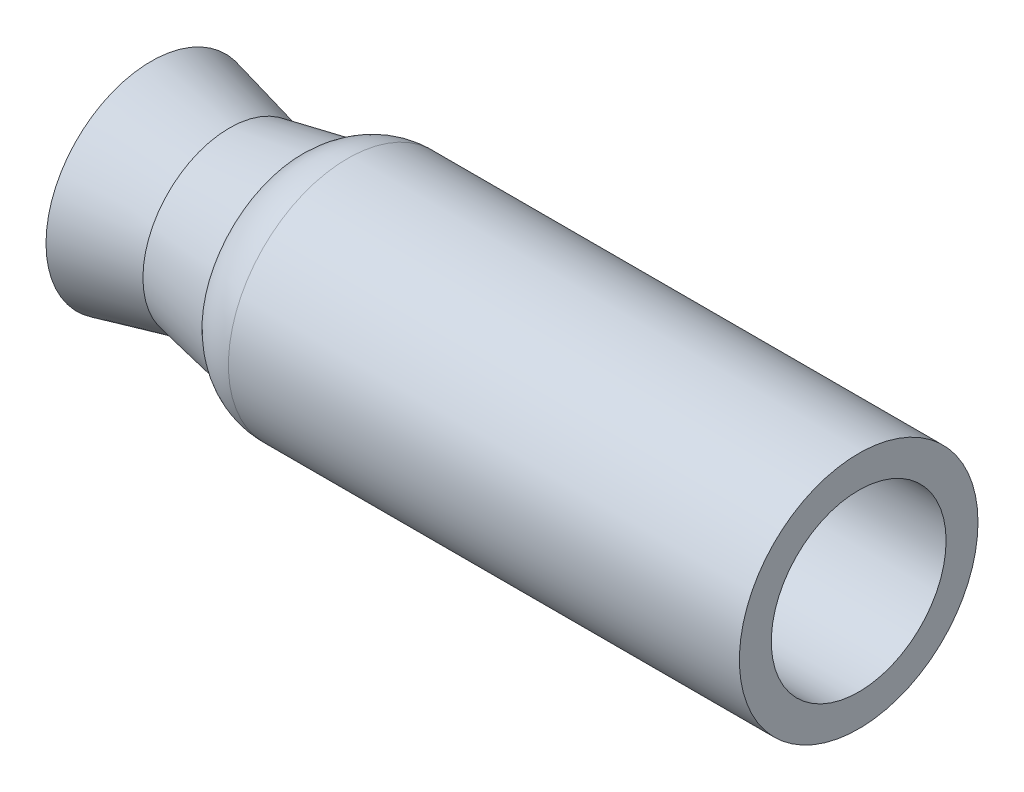
ISO-10303-21;
HEADER;
FILE_DESCRIPTION(('STEP AP214'),'2;1');
FILE_NAME('part.step','',(''),(''),'','','');
FILE_SCHEMA(('AUTOMOTIVE_DESIGN { 1 0 10303 214 1 1 1 1 }'));
ENDSEC;
DATA;
#1=APPLICATION_CONTEXT('core data for automotive mechanical design processes');
#2=APPLICATION_PROTOCOL_DEFINITION('international standard','automotive_design',2000,#1);
#3=PRODUCT_CONTEXT('',#1,'mechanical');
#4=PRODUCT('Part','Part','',(#3));
#5=PRODUCT_RELATED_PRODUCT_CATEGORY('part','',(#4));
#6=PRODUCT_DEFINITION_FORMATION('','',#4);
#7=PRODUCT_DEFINITION_CONTEXT('part definition',#1,'design');
#8=PRODUCT_DEFINITION('design','',#6,#7);
#9=PRODUCT_DEFINITION_SHAPE('','',#8);
#10=(LENGTH_UNIT() NAMED_UNIT(*) SI_UNIT(.MILLI.,.METRE.));
#11=(NAMED_UNIT(*) PLANE_ANGLE_UNIT() SI_UNIT($,.RADIAN.));
#12=(NAMED_UNIT(*) SI_UNIT($,.STERADIAN.) SOLID_ANGLE_UNIT());
#13=UNCERTAINTY_MEASURE_WITH_UNIT(LENGTH_MEASURE(1.E-05),#10,'distance_accuracy_value','');
#14=(GEOMETRIC_REPRESENTATION_CONTEXT(3) GLOBAL_UNCERTAINTY_ASSIGNED_CONTEXT((#13)) GLOBAL_UNIT_ASSIGNED_CONTEXT((#10,
#11,#12)) REPRESENTATION_CONTEXT('',''));
#15=CARTESIAN_POINT('',(0.,0.,0.));
#16=DIRECTION('',(0.,0.,1.));
#17=DIRECTION('',(1.,0.,0.));
#18=AXIS2_PLACEMENT_3D('',#15,#16,#17);
#19=CARTESIAN_POINT('',(-169.474152094102,0.,0.));
#20=DIRECTION('',(1.,0.,0.));
#21=DIRECTION('',(0.,0.,-1.));
#22=AXIS2_PLACEMENT_3D('',#19,#20,#21);
#23=CONICAL_SURFACE('',#22,32.9763480993508,1.32232360308428);
#24=CARTESIAN_POINT('',(-171.93339083728,0.,0.));
#25=DIRECTION('',(1.,0.,0.));
#26=DIRECTION('',(0.,0.,-1.));
#27=AXIS2_PLACEMENT_3D('',#24,#25,#26);
#28=CIRCLE('',#27,23.2834566419965);
#29=CARTESIAN_POINT('',(-171.93339083728,0.,-23.2834566419965));
#30=VERTEX_POINT('',#29);
#31=EDGE_CURVE('E10',#30,#30,#28,.T.);
#32=ORIENTED_EDGE('',*,*,#31,.T.);
#33=EDGE_LOOP('',(#32));
#34=FACE_BOUND('',#33,.T.);
#35=CARTESIAN_POINT('',(-169.474152094102,0.,0.));
#36=DIRECTION('',(1.,0.,0.));
#37=DIRECTION('',(0.,0.,-1.));
#38=AXIS2_PLACEMENT_3D('',#35,#36,#37);
#39=CIRCLE('',#38,32.9763480993508);
#40=CARTESIAN_POINT('',(-169.474152094102,0.,-32.9763480993508));
#41=VERTEX_POINT('',#40);
#42=EDGE_CURVE('E76',#41,#41,#39,.T.);
#43=ORIENTED_EDGE('',*,*,#42,.F.);
#44=EDGE_LOOP('',(#43));
#45=FACE_BOUND('',#44,.T.);
#46=ADVANCED_FACE('F36',(#34,#45),#23,.T.);
#47=CARTESIAN_POINT('',(-18311.1736527159,-1000016.27359422,0.));
#48=CARTESIAN_POINT('',(-2627.39774129121,1000027.16172781,0.));
#49=CARTESIAN_POINT('',(22663.0416842668,-999917.866935543,0.));
#50=B_SPLINE_CURVE_WITH_KNOTS('',2,(#47,#48,#49),.UNSPECIFIED.,.F.,.F.,(3,3),(0.,1.),.UNSPECIFIED.);
#51=CARTESIAN_POINT('',(0.,0.,0.));
#52=DIRECTION('',(1.,0.,0.));
#53=AXIS1_PLACEMENT('',#51,#52);
#54=SURFACE_OF_REVOLUTION('',#50,#53);
#55=CARTESIAN_POINT('',(-144.93339083728,0.,0.));
#56=DIRECTION('',(1.,0.,0.));
#57=DIRECTION('',(0.,0.,-1.));
#58=AXIS2_PLACEMENT_3D('',#55,#56,#57);
#59=CIRCLE('',#58,14.6999999999993);
#60=CARTESIAN_POINT('',(-144.93339083728,0.,-14.6999999999993));
#61=VERTEX_POINT('',#60);
#62=EDGE_CURVE('E42',#61,#61,#59,.T.);
#63=ORIENTED_EDGE('',*,*,#62,.T.);
#64=EDGE_LOOP('',(#63));
#65=FACE_BOUND('',#64,.T.);
#66=ORIENTED_EDGE('',*,*,#31,.F.);
#67=EDGE_LOOP('',(#66));
#68=FACE_BOUND('',#67,.T.);
#69=ADVANCED_FACE('F85',(#65,#68),#54,.F.);
#70=CARTESIAN_POINT('',(-144.93339083728,0.,0.));
#71=DIRECTION('',(-1.,0.,0.));
#72=DIRECTION('',(0.,0.,1.));
#73=AXIS2_PLACEMENT_3D('',#70,#71,#72);
#74=CONICAL_SURFACE('',#73,14.6999999999993,0.360374399038056);
#75=CARTESIAN_POINT('',(-143.63339083728,0.,0.));
#76=DIRECTION('',(1.,0.,0.));
#77=DIRECTION('',(0.,0.,-1.));
#78=AXIS2_PLACEMENT_3D('',#75,#76,#77);
#79=CIRCLE('',#78,14.2101205378918);
#80=CARTESIAN_POINT('',(-143.63339083728,0.,-14.2101205378918));
#81=VERTEX_POINT('',#80);
#82=EDGE_CURVE('E46',#81,#81,#79,.T.);
#83=ORIENTED_EDGE('',*,*,#82,.T.);
#84=EDGE_LOOP('',(#83));
#85=FACE_BOUND('',#84,.T.);
#86=ORIENTED_EDGE('',*,*,#62,.F.);
#87=EDGE_LOOP('',(#86));
#88=FACE_BOUND('',#87,.T.);
#89=ADVANCED_FACE('F88',(#85,#88),#74,.F.);
#90=CARTESIAN_POINT('',(-143.63339083728,0.,0.));
#91=DIRECTION('',(-1.,0.,0.));
#92=DIRECTION('',(0.,0.,1.));
#93=AXIS2_PLACEMENT_3D('',#90,#91,#92);
#94=PLANE('',#93);
#95=ORIENTED_EDGE('',*,*,#82,.F.);
#96=EDGE_LOOP('',(#95));
#97=FACE_BOUND('',#96,.T.);
#98=CARTESIAN_POINT('',(-143.63339083728,0.,0.));
#99=DIRECTION('',(1.,0.,0.));
#100=DIRECTION('',(0.,0.,-1.));
#101=AXIS2_PLACEMENT_3D('',#98,#99,#100);
#102=CIRCLE('',#101,18.9501205378918);
#103=CARTESIAN_POINT('',(-143.63339083728,0.,-18.9501205378918));
#104=VERTEX_POINT('',#103);
#105=EDGE_CURVE('E50',#104,#104,#102,.T.);
#106=ORIENTED_EDGE('',*,*,#105,.T.);
#107=EDGE_LOOP('',(#106));
#108=FACE_BOUND('',#107,.T.);
#109=ADVANCED_FACE('F91',(#97,#108),#94,.F.);
#110=CARTESIAN_POINT('',(-143.63339083728,0.,0.));
#111=DIRECTION('',(1.,0.,0.));
#112=DIRECTION('',(0.,0.,-1.));
#113=AXIS2_PLACEMENT_3D('',#110,#111,#112);
#114=CONICAL_SURFACE('',#113,18.9501205378918,0.190077699291553);
#115=CARTESIAN_POINT('',(-114.93339083728,0.,0.));
#116=DIRECTION('',(1.,0.,0.));
#117=DIRECTION('',(0.,0.,-1.));
#118=AXIS2_PLACEMENT_3D('',#115,#116,#117);
#119=CIRCLE('',#118,24.4720123596702);
#120=CARTESIAN_POINT('',(-114.93339083728,0.,-24.4720123596702));
#121=VERTEX_POINT('',#120);
#122=EDGE_CURVE('E55',#121,#121,#119,.T.);
#123=ORIENTED_EDGE('',*,*,#122,.T.);
#124=EDGE_LOOP('',(#123));
#125=FACE_BOUND('',#124,.T.);
#126=ORIENTED_EDGE('',*,*,#105,.F.);
#127=EDGE_LOOP('',(#126));
#128=FACE_BOUND('',#127,.T.);
#129=ADVANCED_FACE('F95',(#125,#128),#114,.F.);
#130=CARTESIAN_POINT('',(-107.862323025414,0.,0.));
#131=DIRECTION('',(1.,0.,0.));
#132=DIRECTION('',(0.,0.,-1.));
#133=AXIS2_PLACEMENT_3D('',#130,#131,#132);
#134=TOROIDAL_SURFACE('',#133,17.4009445478047,10.);
#135=ORIENTED_EDGE('',*,*,#122,.F.);
#136=EDGE_LOOP('',(#135));
#137=FACE_BOUND('',#136,.T.);
#138=CARTESIAN_POINT('',(-107.862323025414,0.,0.));
#139=DIRECTION('',(1.,0.,0.));
#140=DIRECTION('',(0.,0.,-1.));
#141=AXIS2_PLACEMENT_3D('',#138,#139,#140);
#142=CIRCLE('',#141,27.4009445478047);
#143=CARTESIAN_POINT('',(-107.862323025414,0.,-27.4009445478047));
#144=VERTEX_POINT('',#143);
#145=EDGE_CURVE('E58',#144,#144,#142,.T.);
#146=ORIENTED_EDGE('',*,*,#145,.T.);
#147=EDGE_LOOP('',(#146));
#148=FACE_BOUND('',#147,.T.);
#149=ADVANCED_FACE('F99',(#137,#148),#134,.F.);
#150=CARTESIAN_POINT('',(0.,0.,0.));
#151=DIRECTION('',(1.,0.,0.));
#152=DIRECTION('',(0.,0.,-1.));
#153=AXIS2_PLACEMENT_3D('',#150,#151,#152);
#154=CYLINDRICAL_SURFACE('',#153,27.4009445478047);
#155=ORIENTED_EDGE('',*,*,#145,.F.);
#156=EDGE_LOOP('',(#155));
#157=FACE_BOUND('',#156,.T.);
#158=CARTESIAN_POINT('',(52.322643443905,0.,0.));
#159=DIRECTION('',(1.,0.,0.));
#160=DIRECTION('',(0.,0.,-1.));
#161=AXIS2_PLACEMENT_3D('',#158,#159,#160);
#162=CIRCLE('',#161,27.4009445478048);
#163=CARTESIAN_POINT('',(52.322643443905,0.,-27.4009445478048));
#164=VERTEX_POINT('',#163);
#165=EDGE_CURVE('E61',#164,#164,#162,.T.);
#166=ORIENTED_EDGE('',*,*,#165,.T.);
#167=EDGE_LOOP('',(#166));
#168=FACE_BOUND('',#167,.T.);
#169=ADVANCED_FACE('F103',(#157,#168),#154,.F.);
#170=CARTESIAN_POINT('',(52.322643443905,0.,0.));
#171=DIRECTION('',(-1.,0.,0.));
#172=DIRECTION('',(0.,0.,1.));
#173=AXIS2_PLACEMENT_3D('',#170,#171,#172);
#174=PLANE('',#173);
#175=ORIENTED_EDGE('',*,*,#165,.F.);
#176=EDGE_LOOP('',(#175));
#177=FACE_BOUND('',#176,.T.);
#178=CARTESIAN_POINT('',(52.322643443905,0.,0.));
#179=DIRECTION('',(1.,0.,0.));
#180=DIRECTION('',(0.,0.,-1.));
#181=AXIS2_PLACEMENT_3D('',#178,#179,#180);
#182=CIRCLE('',#181,37.4009445478047);
#183=CARTESIAN_POINT('',(52.322643443905,0.,-37.4009445478047));
#184=VERTEX_POINT('',#183);
#185=EDGE_CURVE('E64',#184,#184,#182,.T.);
#186=ORIENTED_EDGE('',*,*,#185,.T.);
#187=EDGE_LOOP('',(#186));
#188=FACE_BOUND('',#187,.T.);
#189=ADVANCED_FACE('F107',(#177,#188),#174,.F.);
#190=CARTESIAN_POINT('',(0.,0.,0.));
#191=DIRECTION('',(1.,0.,0.));
#192=DIRECTION('',(0.,0.,-1.));
#193=AXIS2_PLACEMENT_3D('',#190,#191,#192);
#194=CYLINDRICAL_SURFACE('',#193,37.4009445478047);
#195=ORIENTED_EDGE('',*,*,#185,.F.);
#196=EDGE_LOOP('',(#195));
#197=FACE_BOUND('',#196,.T.);
#198=CARTESIAN_POINT('',(-107.862323025414,0.,0.));
#199=DIRECTION('',(1.,0.,0.));
#200=DIRECTION('',(0.,0.,-1.));
#201=AXIS2_PLACEMENT_3D('',#198,#199,#200);
#202=CIRCLE('',#201,37.4009445478047);
#203=CARTESIAN_POINT('',(-107.862323025414,0.,-37.4009445478047));
#204=VERTEX_POINT('',#203);
#205=EDGE_CURVE('E67',#204,#204,#202,.T.);
#206=ORIENTED_EDGE('',*,*,#205,.T.);
#207=EDGE_LOOP('',(#206));
#208=FACE_BOUND('',#207,.T.);
#209=ADVANCED_FACE('F111',(#197,#208),#194,.T.);
#210=CARTESIAN_POINT('',(-107.862323025414,0.,0.));
#211=DIRECTION('',(1.,0.,0.));
#212=DIRECTION('',(0.,0.,-1.));
#213=AXIS2_PLACEMENT_3D('',#210,#211,#212);
#214=DEGENERATE_TOROIDAL_SURFACE('',#213,17.4009445478047,20.,.T.);
#215=CARTESIAN_POINT('',(-122.004458649145,0.,0.));
#216=DIRECTION('',(1.,0.,0.));
#217=DIRECTION('',(0.,0.,-1.));
#218=AXIS2_PLACEMENT_3D('',#215,#216,#217);
#219=CIRCLE('',#218,31.5430801715357);
#220=CARTESIAN_POINT('',(-122.004458649145,0.,-31.5430801715357));
#221=VERTEX_POINT('',#220);
#222=EDGE_CURVE('E70',#221,#221,#219,.T.);
#223=ORIENTED_EDGE('',*,*,#222,.T.);
#224=EDGE_LOOP('',(#223));
#225=FACE_BOUND('',#224,.T.);
#226=ORIENTED_EDGE('',*,*,#205,.F.);
#227=EDGE_LOOP('',(#226));
#228=FACE_BOUND('',#227,.T.);
#229=ADVANCED_FACE('F115',(#225,#228),#214,.T.);
#230=CARTESIAN_POINT('',(-122.004458649145,0.,0.));
#231=DIRECTION('',(1.,0.,0.));
#232=DIRECTION('',(0.,0.,-1.));
#233=AXIS2_PLACEMENT_3D('',#230,#231,#232);
#234=CONICAL_SURFACE('',#233,31.5430801715357,0.190077699369038);
#235=CARTESIAN_POINT('',(-144.93339083728,0.,0.));
#236=DIRECTION('',(1.,0.,0.));
#237=DIRECTION('',(0.,0.,-1.));
#238=AXIS2_PLACEMENT_3D('',#235,#236,#237);
#239=CIRCLE('',#238,27.1315441720706);
#240=CARTESIAN_POINT('',(-144.93339083728,0.,-27.1315441720706));
#241=VERTEX_POINT('',#240);
#242=EDGE_CURVE('E73',#241,#241,#239,.T.);
#243=ORIENTED_EDGE('',*,*,#242,.T.);
#244=EDGE_LOOP('',(#243));
#245=FACE_BOUND('',#244,.T.);
#246=ORIENTED_EDGE('',*,*,#222,.F.);
#247=EDGE_LOOP('',(#246));
#248=FACE_BOUND('',#247,.T.);
#249=ADVANCED_FACE('F119',(#245,#248),#234,.T.);
#250=CARTESIAN_POINT('',(-144.93339083728,0.,0.));
#251=DIRECTION('',(-1.,0.,0.));
#252=DIRECTION('',(0.,0.,1.));
#253=AXIS2_PLACEMENT_3D('',#250,#251,#252);
#254=CONICAL_SURFACE('',#253,27.1315441720706,0.233811263039211);
#255=ORIENTED_EDGE('',*,*,#42,.T.);
#256=EDGE_LOOP('',(#255));
#257=FACE_BOUND('',#256,.T.);
#258=ORIENTED_EDGE('',*,*,#242,.F.);
#259=EDGE_LOOP('',(#258));
#260=FACE_BOUND('',#259,.T.);
#261=ADVANCED_FACE('F123',(#257,#260),#254,.T.);
#262=CLOSED_SHELL('',(#46,#69,#89,#109,#129,#149,#169,#189,#209,#229,#249,#261));
#263=MANIFOLD_SOLID_BREP('B2',#262);
#264=ADVANCED_BREP_SHAPE_REPRESENTATION('',(#18,#263),#14);
#265=SHAPE_DEFINITION_REPRESENTATION(#9,#264);
ENDSEC;
END-ISO-10303-21;
